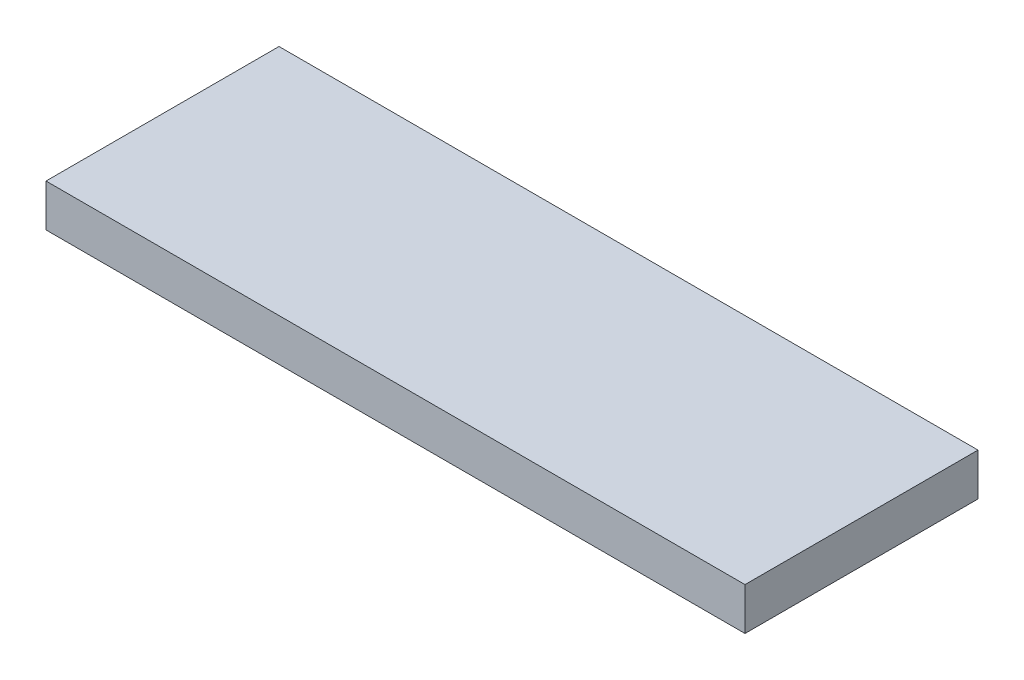
ISO-10303-21;
HEADER;
FILE_DESCRIPTION(('STEP AP214'),'2;1');
FILE_NAME('part.step','',(''),(''),'','','');
FILE_SCHEMA(('AUTOMOTIVE_DESIGN { 1 0 10303 214 1 1 1 1 }'));
ENDSEC;
DATA;
#1=APPLICATION_CONTEXT('core data for automotive mechanical design processes');
#2=APPLICATION_PROTOCOL_DEFINITION('international standard','automotive_design',2000,#1);
#3=PRODUCT_CONTEXT('',#1,'mechanical');
#4=PRODUCT('Part','Part','',(#3));
#5=PRODUCT_RELATED_PRODUCT_CATEGORY('part','',(#4));
#6=PRODUCT_DEFINITION_FORMATION('','',#4);
#7=PRODUCT_DEFINITION_CONTEXT('part definition',#1,'design');
#8=PRODUCT_DEFINITION('design','',#6,#7);
#9=PRODUCT_DEFINITION_SHAPE('','',#8);
#10=(LENGTH_UNIT() NAMED_UNIT(*) SI_UNIT(.MILLI.,.METRE.));
#11=(NAMED_UNIT(*) PLANE_ANGLE_UNIT() SI_UNIT($,.RADIAN.));
#12=(NAMED_UNIT(*) SI_UNIT($,.STERADIAN.) SOLID_ANGLE_UNIT());
#13=UNCERTAINTY_MEASURE_WITH_UNIT(LENGTH_MEASURE(1.E-05),#10,'distance_accuracy_value','');
#14=(GEOMETRIC_REPRESENTATION_CONTEXT(3) GLOBAL_UNCERTAINTY_ASSIGNED_CONTEXT((#13)) GLOBAL_UNIT_ASSIGNED_CONTEXT((#10,
#11,#12)) REPRESENTATION_CONTEXT('',''));
#15=CARTESIAN_POINT('',(0.,0.,0.));
#16=DIRECTION('',(0.,0.,1.));
#17=DIRECTION('',(1.,0.,0.));
#18=AXIS2_PLACEMENT_3D('',#15,#16,#17);
#19=CARTESIAN_POINT('',(0.,10.,0.));
#20=DIRECTION('',(1.,0.,0.));
#21=DIRECTION('',(0.,0.,-1.));
#22=AXIS2_PLACEMENT_3D('',#19,#20,#21);
#23=PLANE('',#22);
#24=DIRECTION('',(0.,0.,1.));
#25=VECTOR('',#24,1.);
#26=CARTESIAN_POINT('',(0.,0.,0.));
#27=LINE('',#26,#25);
#28=CARTESIAN_POINT('',(0.,0.,-55.));
#29=VERTEX_POINT('',#28);
#30=CARTESIAN_POINT('',(0.,0.,0.));
#31=VERTEX_POINT('',#30);
#32=EDGE_CURVE('E94',#29,#31,#27,.T.);
#33=ORIENTED_EDGE('',*,*,#32,.T.);
#34=DIRECTION('',(0.,-1.,0.));
#35=VECTOR('',#34,1.);
#36=CARTESIAN_POINT('',(0.,10.,0.));
#37=LINE('',#36,#35);
#38=CARTESIAN_POINT('',(0.,10.,0.));
#39=VERTEX_POINT('',#38);
#40=EDGE_CURVE('E11',#39,#31,#37,.T.);
#41=ORIENTED_EDGE('',*,*,#40,.F.);
#42=DIRECTION('',(0.,0.,1.));
#43=VECTOR('',#42,1.);
#44=CARTESIAN_POINT('',(0.,10.,0.));
#45=LINE('',#44,#43);
#46=CARTESIAN_POINT('',(0.,10.,-55.));
#47=VERTEX_POINT('',#46);
#48=EDGE_CURVE('E82',#47,#39,#45,.T.);
#49=ORIENTED_EDGE('',*,*,#48,.F.);
#50=DIRECTION('',(0.,-1.,0.));
#51=VECTOR('',#50,1.);
#52=CARTESIAN_POINT('',(0.,10.,-55.));
#53=LINE('',#52,#51);
#54=EDGE_CURVE('E90',#47,#29,#53,.T.);
#55=ORIENTED_EDGE('',*,*,#54,.T.);
#56=EDGE_LOOP('',(#33,#41,#49,#55));
#57=FACE_BOUND('',#56,.T.);
#58=ADVANCED_FACE('F31',(#57),#23,.F.);
#59=CARTESIAN_POINT('',(0.,10.,0.));
#60=DIRECTION('',(0.,0.,-1.));
#61=DIRECTION('',(-1.,0.,0.));
#62=AXIS2_PLACEMENT_3D('',#59,#60,#61);
#63=PLANE('',#62);
#64=DIRECTION('',(1.,0.,0.));
#65=VECTOR('',#64,1.);
#66=CARTESIAN_POINT('',(0.,0.,0.));
#67=LINE('',#66,#65);
#68=CARTESIAN_POINT('',(165.,0.,0.));
#69=VERTEX_POINT('',#68);
#70=EDGE_CURVE('E86',#31,#69,#67,.T.);
#71=ORIENTED_EDGE('',*,*,#70,.T.);
#72=DIRECTION('',(0.,-1.,0.));
#73=VECTOR('',#72,1.);
#74=CARTESIAN_POINT('',(165.,10.,0.));
#75=LINE('',#74,#73);
#76=CARTESIAN_POINT('',(165.,10.,0.));
#77=VERTEX_POINT('',#76);
#78=EDGE_CURVE('E39',#77,#69,#75,.T.);
#79=ORIENTED_EDGE('',*,*,#78,.F.);
#80=DIRECTION('',(1.,0.,0.));
#81=VECTOR('',#80,1.);
#82=CARTESIAN_POINT('',(0.,10.,0.));
#83=LINE('',#82,#81);
#84=EDGE_CURVE('E77',#39,#77,#83,.T.);
#85=ORIENTED_EDGE('',*,*,#84,.F.);
#86=ORIENTED_EDGE('',*,*,#40,.T.);
#87=EDGE_LOOP('',(#71,#79,#85,#86));
#88=FACE_BOUND('',#87,.T.);
#89=ADVANCED_FACE('F85',(#88),#63,.F.);
#90=CARTESIAN_POINT('',(165.,10.,0.));
#91=DIRECTION('',(-1.,0.,0.));
#92=DIRECTION('',(0.,0.,1.));
#93=AXIS2_PLACEMENT_3D('',#90,#91,#92);
#94=PLANE('',#93);
#95=DIRECTION('',(0.,0.,-1.));
#96=VECTOR('',#95,1.);
#97=CARTESIAN_POINT('',(165.,0.,0.));
#98=LINE('',#97,#96);
#99=CARTESIAN_POINT('',(165.,0.,-55.));
#100=VERTEX_POINT('',#99);
#101=EDGE_CURVE('E64',#69,#100,#98,.T.);
#102=ORIENTED_EDGE('',*,*,#101,.T.);
#103=DIRECTION('',(0.,-1.,0.));
#104=VECTOR('',#103,1.);
#105=CARTESIAN_POINT('',(165.,10.,-55.));
#106=LINE('',#105,#104);
#107=CARTESIAN_POINT('',(165.,10.,-55.));
#108=VERTEX_POINT('',#107);
#109=EDGE_CURVE('E87',#108,#100,#106,.T.);
#110=ORIENTED_EDGE('',*,*,#109,.F.);
#111=DIRECTION('',(0.,0.,-1.));
#112=VECTOR('',#111,1.);
#113=CARTESIAN_POINT('',(165.,10.,0.));
#114=LINE('',#113,#112);
#115=EDGE_CURVE('E80',#77,#108,#114,.T.);
#116=ORIENTED_EDGE('',*,*,#115,.F.);
#117=ORIENTED_EDGE('',*,*,#78,.T.);
#118=EDGE_LOOP('',(#102,#110,#116,#117));
#119=FACE_BOUND('',#118,.T.);
#120=ADVANCED_FACE('F88',(#119),#94,.F.);
#121=CARTESIAN_POINT('',(0.,10.,-55.));
#122=DIRECTION('',(0.,0.,1.));
#123=DIRECTION('',(1.,0.,0.));
#124=AXIS2_PLACEMENT_3D('',#121,#122,#123);
#125=PLANE('',#124);
#126=DIRECTION('',(-1.,0.,0.));
#127=VECTOR('',#126,1.);
#128=CARTESIAN_POINT('',(0.,0.,-55.));
#129=LINE('',#128,#127);
#130=EDGE_CURVE('E70',#100,#29,#129,.T.);
#131=ORIENTED_EDGE('',*,*,#130,.T.);
#132=ORIENTED_EDGE('',*,*,#54,.F.);
#133=DIRECTION('',(-1.,0.,0.));
#134=VECTOR('',#133,1.);
#135=CARTESIAN_POINT('',(0.,10.,-55.));
#136=LINE('',#135,#134);
#137=EDGE_CURVE('E47',#108,#47,#136,.T.);
#138=ORIENTED_EDGE('',*,*,#137,.F.);
#139=ORIENTED_EDGE('',*,*,#109,.T.);
#140=EDGE_LOOP('',(#131,#132,#138,#139));
#141=FACE_BOUND('',#140,.T.);
#142=ADVANCED_FACE('F101',(#141),#125,.F.);
#143=CARTESIAN_POINT('',(0.,10.,-55.));
#144=DIRECTION('',(0.,-1.,0.));
#145=DIRECTION('',(0.,0.,-1.));
#146=AXIS2_PLACEMENT_3D('',#143,#144,#145);
#147=PLANE('',#146);
#148=ORIENTED_EDGE('',*,*,#48,.T.);
#149=ORIENTED_EDGE('',*,*,#84,.T.);
#150=ORIENTED_EDGE('',*,*,#115,.T.);
#151=ORIENTED_EDGE('',*,*,#137,.T.);
#152=EDGE_LOOP('',(#148,#149,#150,#151));
#153=FACE_BOUND('',#152,.T.);
#154=ADVANCED_FACE('F78',(#153),#147,.F.);
#155=CARTESIAN_POINT('',(0.,0.,-55.));
#156=DIRECTION('',(0.,-1.,0.));
#157=DIRECTION('',(0.,0.,-1.));
#158=AXIS2_PLACEMENT_3D('',#155,#156,#157);
#159=PLANE('',#158);
#160=ORIENTED_EDGE('',*,*,#32,.F.);
#161=ORIENTED_EDGE('',*,*,#130,.F.);
#162=ORIENTED_EDGE('',*,*,#101,.F.);
#163=ORIENTED_EDGE('',*,*,#70,.F.);
#164=EDGE_LOOP('',(#160,#161,#162,#163));
#165=FACE_BOUND('',#164,.T.);
#166=ADVANCED_FACE('F104',(#165),#159,.T.);
#167=CLOSED_SHELL('',(#58,#89,#120,#142,#154,#166));
#168=MANIFOLD_SOLID_BREP('B2',#167);
#169=ADVANCED_BREP_SHAPE_REPRESENTATION('',(#18,#168),#14);
#170=SHAPE_DEFINITION_REPRESENTATION(#9,#169);
ENDSEC;
END-ISO-10303-21;
